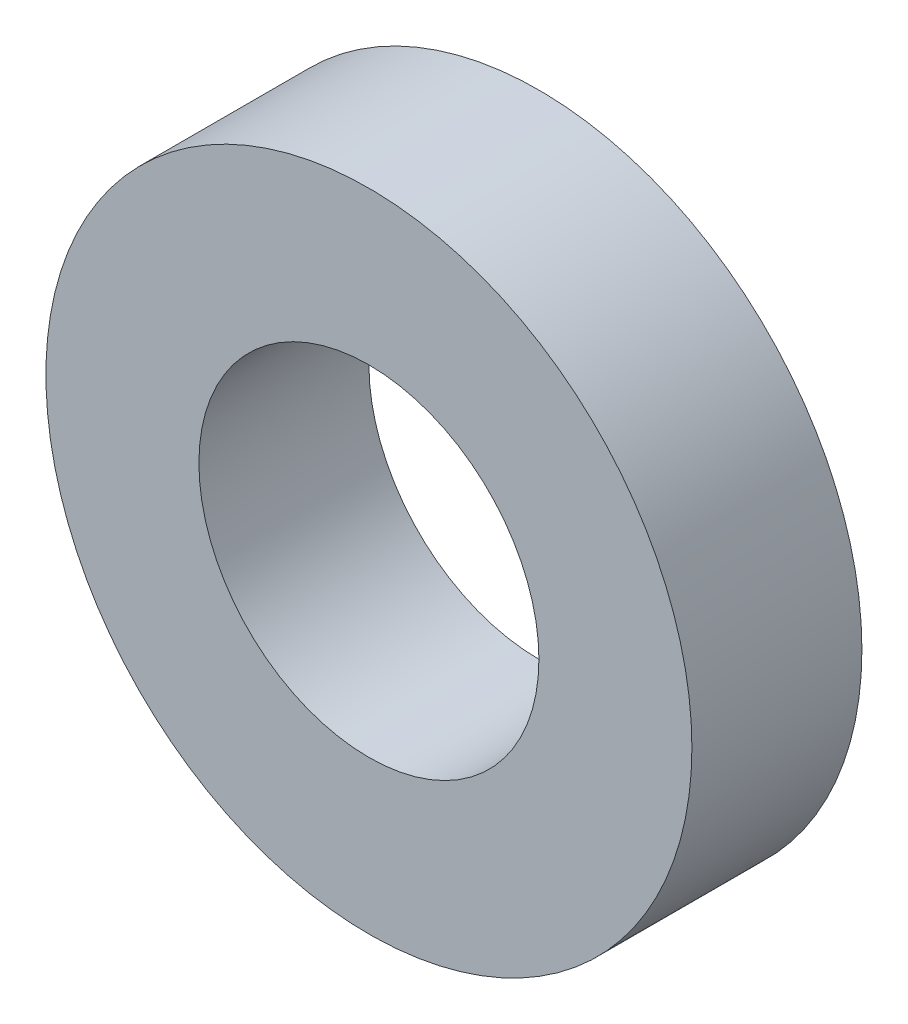
ISO-10303-21;
HEADER;
FILE_DESCRIPTION(('STEP AP214'),'2;1');
FILE_NAME('part.step','',(''),(''),'','','');
FILE_SCHEMA(('AUTOMOTIVE_DESIGN { 1 0 10303 214 1 1 1 1 }'));
ENDSEC;
DATA;
#1=APPLICATION_CONTEXT('core data for automotive mechanical design processes');
#2=APPLICATION_PROTOCOL_DEFINITION('international standard','automotive_design',2000,#1);
#3=PRODUCT_CONTEXT('',#1,'mechanical');
#4=PRODUCT('Part','Part','',(#3));
#5=PRODUCT_RELATED_PRODUCT_CATEGORY('part','',(#4));
#6=PRODUCT_DEFINITION_FORMATION('','',#4);
#7=PRODUCT_DEFINITION_CONTEXT('part definition',#1,'design');
#8=PRODUCT_DEFINITION('design','',#6,#7);
#9=PRODUCT_DEFINITION_SHAPE('','',#8);
#10=(LENGTH_UNIT() NAMED_UNIT(*) SI_UNIT(.MILLI.,.METRE.));
#11=(NAMED_UNIT(*) PLANE_ANGLE_UNIT() SI_UNIT($,.RADIAN.));
#12=(NAMED_UNIT(*) SI_UNIT($,.STERADIAN.) SOLID_ANGLE_UNIT());
#13=UNCERTAINTY_MEASURE_WITH_UNIT(LENGTH_MEASURE(1.E-05),#10,'distance_accuracy_value','');
#14=(GEOMETRIC_REPRESENTATION_CONTEXT(3) GLOBAL_UNCERTAINTY_ASSIGNED_CONTEXT((#13)) GLOBAL_UNIT_ASSIGNED_CONTEXT((#10,
#11,#12)) REPRESENTATION_CONTEXT('',''));
#15=CARTESIAN_POINT('',(0.,0.,0.));
#16=DIRECTION('',(0.,0.,1.));
#17=DIRECTION('',(1.,0.,0.));
#18=AXIS2_PLACEMENT_3D('',#15,#16,#17);
#19=CARTESIAN_POINT('',(0.,0.,5.));
#20=DIRECTION('',(0.,0.,1.));
#21=DIRECTION('',(1.,0.,0.));
#22=AXIS2_PLACEMENT_3D('',#19,#20,#21);
#23=PLANE('',#22);
#24=CARTESIAN_POINT('',(0.,0.,5.));
#25=DIRECTION('',(0.,0.,1.));
#26=DIRECTION('',(1.,0.,0.));
#27=AXIS2_PLACEMENT_3D('',#24,#25,#26);
#28=CIRCLE('',#27,9.5);
#29=CARTESIAN_POINT('',(9.5,0.,5.));
#30=VERTEX_POINT('',#29);
#31=EDGE_CURVE('E10',#30,#30,#28,.T.);
#32=ORIENTED_EDGE('',*,*,#31,.T.);
#33=EDGE_LOOP('',(#32));
#34=FACE_BOUND('',#33,.T.);
#35=CARTESIAN_POINT('',(0.,0.,5.));
#36=DIRECTION('',(0.,0.,1.));
#37=DIRECTION('',(1.,0.,0.));
#38=AXIS2_PLACEMENT_3D('',#35,#36,#37);
#39=CIRCLE('',#38,5.);
#40=CARTESIAN_POINT('',(5.,0.,5.));
#41=VERTEX_POINT('',#40);
#42=EDGE_CURVE('E50',#41,#41,#39,.T.);
#43=ORIENTED_EDGE('',*,*,#42,.F.);
#44=EDGE_LOOP('',(#43));
#45=FACE_BOUND('',#44,.T.);
#46=ADVANCED_FACE('F37',(#34,#45),#23,.T.);
#47=CARTESIAN_POINT('',(0.,0.,0.));
#48=DIRECTION('',(0.,0.,1.));
#49=DIRECTION('',(1.,0.,0.));
#50=AXIS2_PLACEMENT_3D('',#47,#48,#49);
#51=PLANE('',#50);
#52=CARTESIAN_POINT('',(0.,0.,0.));
#53=DIRECTION('',(0.,0.,1.));
#54=DIRECTION('',(1.,0.,0.));
#55=AXIS2_PLACEMENT_3D('',#52,#53,#54);
#56=CIRCLE('',#55,9.5);
#57=CARTESIAN_POINT('',(9.5,0.,0.));
#58=VERTEX_POINT('',#57);
#59=EDGE_CURVE('E41',#58,#58,#56,.T.);
#60=ORIENTED_EDGE('',*,*,#59,.F.);
#61=EDGE_LOOP('',(#60));
#62=FACE_BOUND('',#61,.T.);
#63=CARTESIAN_POINT('',(0.,0.,0.));
#64=DIRECTION('',(0.,0.,1.));
#65=DIRECTION('',(1.,0.,0.));
#66=AXIS2_PLACEMENT_3D('',#63,#64,#65);
#67=CIRCLE('',#66,5.);
#68=CARTESIAN_POINT('',(5.,0.,0.));
#69=VERTEX_POINT('',#68);
#70=EDGE_CURVE('E52',#69,#69,#67,.T.);
#71=ORIENTED_EDGE('',*,*,#70,.T.);
#72=EDGE_LOOP('',(#71));
#73=FACE_BOUND('',#72,.T.);
#74=ADVANCED_FACE('F64',(#62,#73),#51,.F.);
#75=CARTESIAN_POINT('',(0.,0.,5.));
#76=DIRECTION('',(0.,0.,-1.));
#77=DIRECTION('',(-1.,0.,0.));
#78=AXIS2_PLACEMENT_3D('',#75,#76,#77);
#79=CYLINDRICAL_SURFACE('',#78,9.5);
#80=ORIENTED_EDGE('',*,*,#31,.F.);
#81=EDGE_LOOP('',(#80));
#82=FACE_BOUND('',#81,.T.);
#83=ORIENTED_EDGE('',*,*,#59,.T.);
#84=EDGE_LOOP('',(#83));
#85=FACE_BOUND('',#84,.T.);
#86=ADVANCED_FACE('F39',(#82,#85),#79,.T.);
#87=CARTESIAN_POINT('',(0.,0.,5.));
#88=DIRECTION('',(0.,0.,-1.));
#89=DIRECTION('',(-1.,0.,0.));
#90=AXIS2_PLACEMENT_3D('',#87,#88,#89);
#91=CYLINDRICAL_SURFACE('',#90,5.);
#92=ORIENTED_EDGE('',*,*,#42,.T.);
#93=EDGE_LOOP('',(#92));
#94=FACE_BOUND('',#93,.T.);
#95=ORIENTED_EDGE('',*,*,#70,.F.);
#96=EDGE_LOOP('',(#95));
#97=FACE_BOUND('',#96,.T.);
#98=ADVANCED_FACE('F60',(#94,#97),#91,.F.);
#99=CLOSED_SHELL('',(#46,#74,#86,#98));
#100=MANIFOLD_SOLID_BREP('B2',#99);
#101=ADVANCED_BREP_SHAPE_REPRESENTATION('',(#18,#100),#14);
#102=SHAPE_DEFINITION_REPRESENTATION(#9,#101);
ENDSEC;
END-ISO-10303-21;
